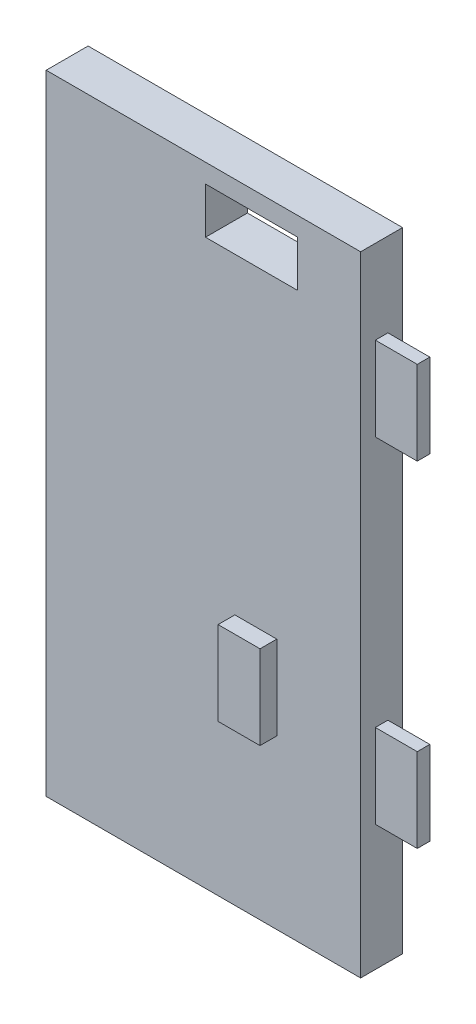
ISO-10303-21;
HEADER;
FILE_DESCRIPTION(('STEP AP214'),'2;1');
FILE_NAME('part.step','',(''),(''),'','','');
FILE_SCHEMA(('AUTOMOTIVE_DESIGN { 1 0 10303 214 1 1 1 1 }'));
ENDSEC;
DATA;
#1=APPLICATION_CONTEXT('core data for automotive mechanical design processes');
#2=APPLICATION_PROTOCOL_DEFINITION('international standard','automotive_design',2000,#1);
#3=PRODUCT_CONTEXT('',#1,'mechanical');
#4=PRODUCT('Part','Part','',(#3));
#5=PRODUCT_RELATED_PRODUCT_CATEGORY('part','',(#4));
#6=PRODUCT_DEFINITION_FORMATION('','',#4);
#7=PRODUCT_DEFINITION_CONTEXT('part definition',#1,'design');
#8=PRODUCT_DEFINITION('design','',#6,#7);
#9=PRODUCT_DEFINITION_SHAPE('','',#8);
#10=(LENGTH_UNIT() NAMED_UNIT(*) SI_UNIT(.MILLI.,.METRE.));
#11=(NAMED_UNIT(*) PLANE_ANGLE_UNIT() SI_UNIT($,.RADIAN.));
#12=(NAMED_UNIT(*) SI_UNIT($,.STERADIAN.) SOLID_ANGLE_UNIT());
#13=UNCERTAINTY_MEASURE_WITH_UNIT(LENGTH_MEASURE(1.E-05),#10,'distance_accuracy_value','');
#14=(GEOMETRIC_REPRESENTATION_CONTEXT(3) GLOBAL_UNCERTAINTY_ASSIGNED_CONTEXT((#13)) GLOBAL_UNIT_ASSIGNED_CONTEXT((#10,
#11,#12)) REPRESENTATION_CONTEXT('',''));
#15=CARTESIAN_POINT('',(0.,0.,0.));
#16=DIRECTION('',(0.,0.,1.));
#17=DIRECTION('',(1.,0.,0.));
#18=AXIS2_PLACEMENT_3D('',#15,#16,#17);
#19=CARTESIAN_POINT('',(37.5,-75.,10.));
#20=DIRECTION('',(-1.,0.,0.));
#21=DIRECTION('',(0.,0.,1.));
#22=AXIS2_PLACEMENT_3D('',#19,#20,#21);
#23=PLANE('',#22);
#24=DIRECTION('',(0.,0.,1.));
#25=VECTOR('',#24,1.);
#26=CARTESIAN_POINT('',(37.5,-25.,3.5));
#27=LINE('',#26,#25);
#28=CARTESIAN_POINT('',(37.5,-25.,3.5));
#29=VERTEX_POINT('',#28);
#30=CARTESIAN_POINT('',(37.5,-25.,6.5));
#31=VERTEX_POINT('',#30);
#32=EDGE_CURVE('E252',#29,#31,#27,.T.);
#33=ORIENTED_EDGE('',*,*,#32,.F.);
#34=DIRECTION('',(0.,1.,0.));
#35=VECTOR('',#34,1.);
#36=CARTESIAN_POINT('',(37.5,-45.,3.5));
#37=LINE('',#36,#35);
#38=CARTESIAN_POINT('',(37.5,-45.,3.5));
#39=VERTEX_POINT('',#38);
#40=EDGE_CURVE('E281',#39,#29,#37,.T.);
#41=ORIENTED_EDGE('',*,*,#40,.F.);
#42=DIRECTION('',(0.,0.,-1.));
#43=VECTOR('',#42,1.);
#44=CARTESIAN_POINT('',(37.5,-45.,3.5));
#45=LINE('',#44,#43);
#46=CARTESIAN_POINT('',(37.5,-45.,6.5));
#47=VERTEX_POINT('',#46);
#48=EDGE_CURVE('E287',#47,#39,#45,.T.);
#49=ORIENTED_EDGE('',*,*,#48,.F.);
#50=DIRECTION('',(0.,-1.,0.));
#51=VECTOR('',#50,1.);
#52=CARTESIAN_POINT('',(37.5,-45.,6.5));
#53=LINE('',#52,#51);
#54=EDGE_CURVE('E288',#31,#47,#53,.T.);
#55=ORIENTED_EDGE('',*,*,#54,.F.);
#56=EDGE_LOOP('',(#33,#41,#49,#55));
#57=FACE_BOUND('',#56,.T.);
#58=DIRECTION('',(0.,1.,0.));
#59=VECTOR('',#58,1.);
#60=CARTESIAN_POINT('',(37.5,-75.,0.));
#61=LINE('',#60,#59);
#62=CARTESIAN_POINT('',(37.5,-75.,0.));
#63=VERTEX_POINT('',#62);
#64=CARTESIAN_POINT('',(37.5,75.,0.));
#65=VERTEX_POINT('',#64);
#66=EDGE_CURVE('E367',#63,#65,#61,.T.);
#67=ORIENTED_EDGE('',*,*,#66,.T.);
#68=DIRECTION('',(0.,0.,-1.));
#69=VECTOR('',#68,1.);
#70=CARTESIAN_POINT('',(37.5,75.,10.));
#71=LINE('',#70,#69);
#72=CARTESIAN_POINT('',(37.5,75.,10.));
#73=VERTEX_POINT('',#72);
#74=EDGE_CURVE('E376',#73,#65,#71,.T.);
#75=ORIENTED_EDGE('',*,*,#74,.F.);
#76=DIRECTION('',(0.,1.,0.));
#77=VECTOR('',#76,1.);
#78=CARTESIAN_POINT('',(37.5,-75.,10.));
#79=LINE('',#78,#77);
#80=CARTESIAN_POINT('',(37.5,-75.,10.));
#81=VERTEX_POINT('',#80);
#82=EDGE_CURVE('E372',#81,#73,#79,.T.);
#83=ORIENTED_EDGE('',*,*,#82,.F.);
#84=DIRECTION('',(0.,0.,-1.));
#85=VECTOR('',#84,1.);
#86=CARTESIAN_POINT('',(37.5,-75.,10.));
#87=LINE('',#86,#85);
#88=EDGE_CURVE('E387',#81,#63,#87,.T.);
#89=ORIENTED_EDGE('',*,*,#88,.T.);
#90=EDGE_LOOP('',(#67,#75,#83,#89));
#91=FACE_BOUND('',#90,.T.);
#92=DIRECTION('',(0.,0.,1.));
#93=VECTOR('',#92,1.);
#94=CARTESIAN_POINT('',(37.5,55.,3.5));
#95=LINE('',#94,#93);
#96=CARTESIAN_POINT('',(37.5,55.,3.5));
#97=VERTEX_POINT('',#96);
#98=CARTESIAN_POINT('',(37.5,55.,6.5));
#99=VERTEX_POINT('',#98);
#100=EDGE_CURVE('E65',#97,#99,#95,.T.);
#101=ORIENTED_EDGE('',*,*,#100,.F.);
#102=DIRECTION('',(0.,1.,0.));
#103=VECTOR('',#102,1.);
#104=CARTESIAN_POINT('',(37.5,35.,3.5));
#105=LINE('',#104,#103);
#106=CARTESIAN_POINT('',(37.5,35.,3.5));
#107=VERTEX_POINT('',#106);
#108=EDGE_CURVE('E241',#107,#97,#105,.T.);
#109=ORIENTED_EDGE('',*,*,#108,.F.);
#110=DIRECTION('',(0.,0.,-1.));
#111=VECTOR('',#110,1.);
#112=CARTESIAN_POINT('',(37.5,35.,3.5));
#113=LINE('',#112,#111);
#114=CARTESIAN_POINT('',(37.5,35.,6.5));
#115=VERTEX_POINT('',#114);
#116=EDGE_CURVE('E254',#115,#107,#113,.T.);
#117=ORIENTED_EDGE('',*,*,#116,.F.);
#118=DIRECTION('',(0.,-1.,0.));
#119=VECTOR('',#118,1.);
#120=CARTESIAN_POINT('',(37.5,35.,6.5));
#121=LINE('',#120,#119);
#122=EDGE_CURVE('E253',#99,#115,#121,.T.);
#123=ORIENTED_EDGE('',*,*,#122,.F.);
#124=EDGE_LOOP('',(#101,#109,#117,#123));
#125=FACE_BOUND('',#124,.T.);
#126=ADVANCED_FACE('F39',(#57,#91,#125),#23,.F.);
#127=CARTESIAN_POINT('',(0.,0.,10.));
#128=DIRECTION('',(0.,0.,-1.));
#129=DIRECTION('',(-1.,0.,0.));
#130=AXIS2_PLACEMENT_3D('',#127,#128,#129);
#131=PLANE('',#130);
#132=DIRECTION('',(-1.,0.,0.));
#133=VECTOR('',#132,1.);
#134=CARTESIAN_POINT('',(22.5,70.5,10.));
#135=LINE('',#134,#133);
#136=CARTESIAN_POINT('',(22.5,70.5,10.));
#137=VERTEX_POINT('',#136);
#138=CARTESIAN_POINT('',(0.5,70.5,10.));
#139=VERTEX_POINT('',#138);
#140=EDGE_CURVE('E333',#137,#139,#135,.T.);
#141=ORIENTED_EDGE('',*,*,#140,.F.);
#142=DIRECTION('',(0.,1.,0.));
#143=VECTOR('',#142,1.);
#144=CARTESIAN_POINT('',(22.5,59.5,10.));
#145=LINE('',#144,#143);
#146=CARTESIAN_POINT('',(22.5,59.5,10.));
#147=VERTEX_POINT('',#146);
#148=EDGE_CURVE('E345',#147,#137,#145,.T.);
#149=ORIENTED_EDGE('',*,*,#148,.F.);
#150=DIRECTION('',(1.,0.,0.));
#151=VECTOR('',#150,1.);
#152=CARTESIAN_POINT('',(22.5,59.5,10.));
#153=LINE('',#152,#151);
#154=CARTESIAN_POINT('',(0.5,59.5,10.));
#155=VERTEX_POINT('',#154);
#156=EDGE_CURVE('E337',#155,#147,#153,.T.);
#157=ORIENTED_EDGE('',*,*,#156,.F.);
#158=DIRECTION('',(0.,-1.,0.));
#159=VECTOR('',#158,1.);
#160=CARTESIAN_POINT('',(0.5,59.5,10.));
#161=LINE('',#160,#159);
#162=EDGE_CURVE('E340',#139,#155,#161,.T.);
#163=ORIENTED_EDGE('',*,*,#162,.F.);
#164=EDGE_LOOP('',(#141,#149,#157,#163));
#165=FACE_BOUND('',#164,.T.);
#166=DIRECTION('',(-1.,0.,0.));
#167=VECTOR('',#166,1.);
#168=CARTESIAN_POINT('',(37.5,75.,10.));
#169=LINE('',#168,#167);
#170=CARTESIAN_POINT('',(-37.5,75.,10.));
#171=VERTEX_POINT('',#170);
#172=EDGE_CURVE('E368',#73,#171,#169,.T.);
#173=ORIENTED_EDGE('',*,*,#172,.T.);
#174=DIRECTION('',(0.,-1.,0.));
#175=VECTOR('',#174,1.);
#176=CARTESIAN_POINT('',(-37.5,-75.,10.));
#177=LINE('',#176,#175);
#178=CARTESIAN_POINT('',(-37.5,-75.,10.));
#179=VERTEX_POINT('',#178);
#180=EDGE_CURVE('E369',#171,#179,#177,.T.);
#181=ORIENTED_EDGE('',*,*,#180,.T.);
#182=DIRECTION('',(1.,0.,0.));
#183=VECTOR('',#182,1.);
#184=CARTESIAN_POINT('',(37.5,-75.,10.));
#185=LINE('',#184,#183);
#186=EDGE_CURVE('E375',#179,#81,#185,.T.);
#187=ORIENTED_EDGE('',*,*,#186,.T.);
#188=ORIENTED_EDGE('',*,*,#82,.T.);
#189=EDGE_LOOP('',(#173,#181,#187,#188));
#190=FACE_BOUND('',#189,.T.);
#191=DIRECTION('',(0.,1.,0.));
#192=VECTOR('',#191,1.);
#193=CARTESIAN_POINT('',(17.5,-35.,10.));
#194=LINE('',#193,#192);
#195=CARTESIAN_POINT('',(17.5,-35.,10.));
#196=VERTEX_POINT('',#195);
#197=CARTESIAN_POINT('',(17.5,-15.,10.));
#198=VERTEX_POINT('',#197);
#199=EDGE_CURVE('E269',#196,#198,#194,.T.);
#200=ORIENTED_EDGE('',*,*,#199,.F.);
#201=DIRECTION('',(1.,0.,0.));
#202=VECTOR('',#201,1.);
#203=CARTESIAN_POINT('',(7.5,-35.,10.));
#204=LINE('',#203,#202);
#205=CARTESIAN_POINT('',(7.5,-35.,10.));
#206=VERTEX_POINT('',#205);
#207=EDGE_CURVE('E308',#206,#196,#204,.T.);
#208=ORIENTED_EDGE('',*,*,#207,.F.);
#209=DIRECTION('',(0.,-1.,0.));
#210=VECTOR('',#209,1.);
#211=CARTESIAN_POINT('',(7.5,-35.,10.));
#212=LINE('',#211,#210);
#213=CARTESIAN_POINT('',(7.5,-15.,10.));
#214=VERTEX_POINT('',#213);
#215=EDGE_CURVE('E318',#214,#206,#212,.T.);
#216=ORIENTED_EDGE('',*,*,#215,.F.);
#217=DIRECTION('',(-1.,0.,0.));
#218=VECTOR('',#217,1.);
#219=CARTESIAN_POINT('',(7.5,-15.,10.));
#220=LINE('',#219,#218);
#221=EDGE_CURVE('E312',#198,#214,#220,.T.);
#222=ORIENTED_EDGE('',*,*,#221,.F.);
#223=EDGE_LOOP('',(#200,#208,#216,#222));
#224=FACE_BOUND('',#223,.T.);
#225=ADVANCED_FACE('F406',(#165,#190,#224),#131,.F.);
#226=CARTESIAN_POINT('',(0.,0.,0.));
#227=DIRECTION('',(0.,0.,-1.));
#228=DIRECTION('',(-1.,0.,0.));
#229=AXIS2_PLACEMENT_3D('',#226,#227,#228);
#230=PLANE('',#229);
#231=DIRECTION('',(-1.,0.,0.));
#232=VECTOR('',#231,1.);
#233=CARTESIAN_POINT('',(37.5,75.,0.));
#234=LINE('',#233,#232);
#235=CARTESIAN_POINT('',(-37.5,75.,0.));
#236=VERTEX_POINT('',#235);
#237=EDGE_CURVE('E364',#65,#236,#234,.T.);
#238=ORIENTED_EDGE('',*,*,#237,.F.);
#239=ORIENTED_EDGE('',*,*,#66,.F.);
#240=DIRECTION('',(1.,0.,0.));
#241=VECTOR('',#240,1.);
#242=CARTESIAN_POINT('',(37.5,-75.,0.));
#243=LINE('',#242,#241);
#244=CARTESIAN_POINT('',(-37.5,-75.,0.));
#245=VERTEX_POINT('',#244);
#246=EDGE_CURVE('E381',#245,#63,#243,.T.);
#247=ORIENTED_EDGE('',*,*,#246,.F.);
#248=DIRECTION('',(0.,-1.,0.));
#249=VECTOR('',#248,1.);
#250=CARTESIAN_POINT('',(-37.5,-75.,0.));
#251=LINE('',#250,#249);
#252=EDGE_CURVE('E377',#236,#245,#251,.T.);
#253=ORIENTED_EDGE('',*,*,#252,.F.);
#254=EDGE_LOOP('',(#238,#239,#247,#253));
#255=FACE_BOUND('',#254,.T.);
#256=DIRECTION('',(0.,1.,0.));
#257=VECTOR('',#256,1.);
#258=CARTESIAN_POINT('',(22.5,59.5,0.));
#259=LINE('',#258,#257);
#260=CARTESIAN_POINT('',(22.5,59.5,0.));
#261=VERTEX_POINT('',#260);
#262=CARTESIAN_POINT('',(22.5,70.5,0.));
#263=VERTEX_POINT('',#262);
#264=EDGE_CURVE('E336',#261,#263,#259,.T.);
#265=ORIENTED_EDGE('',*,*,#264,.T.);
#266=DIRECTION('',(-1.,0.,0.));
#267=VECTOR('',#266,1.);
#268=CARTESIAN_POINT('',(22.5,70.5,0.));
#269=LINE('',#268,#267);
#270=CARTESIAN_POINT('',(0.5,70.5,0.));
#271=VERTEX_POINT('',#270);
#272=EDGE_CURVE('E331',#263,#271,#269,.T.);
#273=ORIENTED_EDGE('',*,*,#272,.T.);
#274=DIRECTION('',(0.,-1.,0.));
#275=VECTOR('',#274,1.);
#276=CARTESIAN_POINT('',(0.5,59.5,0.));
#277=LINE('',#276,#275);
#278=CARTESIAN_POINT('',(0.5,59.5,0.));
#279=VERTEX_POINT('',#278);
#280=EDGE_CURVE('E346',#271,#279,#277,.T.);
#281=ORIENTED_EDGE('',*,*,#280,.T.);
#282=DIRECTION('',(1.,0.,0.));
#283=VECTOR('',#282,1.);
#284=CARTESIAN_POINT('',(22.5,59.5,0.));
#285=LINE('',#284,#283);
#286=EDGE_CURVE('E353',#279,#261,#285,.T.);
#287=ORIENTED_EDGE('',*,*,#286,.T.);
#288=EDGE_LOOP('',(#265,#273,#281,#287));
#289=FACE_BOUND('',#288,.T.);
#290=ADVANCED_FACE('F396',(#255,#289),#230,.T.);
#291=CARTESIAN_POINT('',(37.5,75.,10.));
#292=DIRECTION('',(0.,-1.,0.));
#293=DIRECTION('',(0.,0.,-1.));
#294=AXIS2_PLACEMENT_3D('',#291,#292,#293);
#295=PLANE('',#294);
#296=ORIENTED_EDGE('',*,*,#237,.T.);
#297=DIRECTION('',(0.,0.,-1.));
#298=VECTOR('',#297,1.);
#299=CARTESIAN_POINT('',(-37.5,75.,10.));
#300=LINE('',#299,#298);
#301=EDGE_CURVE('E11',#171,#236,#300,.T.);
#302=ORIENTED_EDGE('',*,*,#301,.F.);
#303=ORIENTED_EDGE('',*,*,#172,.F.);
#304=ORIENTED_EDGE('',*,*,#74,.T.);
#305=EDGE_LOOP('',(#296,#302,#303,#304));
#306=FACE_BOUND('',#305,.T.);
#307=ADVANCED_FACE('F41',(#306),#295,.F.);
#308=CARTESIAN_POINT('',(-37.5,-75.,10.));
#309=DIRECTION('',(1.,0.,0.));
#310=DIRECTION('',(0.,0.,-1.));
#311=AXIS2_PLACEMENT_3D('',#308,#309,#310);
#312=PLANE('',#311);
#313=ORIENTED_EDGE('',*,*,#252,.T.);
#314=DIRECTION('',(0.,0.,-1.));
#315=VECTOR('',#314,1.);
#316=CARTESIAN_POINT('',(-37.5,-75.,10.));
#317=LINE('',#316,#315);
#318=EDGE_CURVE('E50',#179,#245,#317,.T.);
#319=ORIENTED_EDGE('',*,*,#318,.F.);
#320=ORIENTED_EDGE('',*,*,#180,.F.);
#321=ORIENTED_EDGE('',*,*,#301,.T.);
#322=EDGE_LOOP('',(#313,#319,#320,#321));
#323=FACE_BOUND('',#322,.T.);
#324=ADVANCED_FACE('F407',(#323),#312,.F.);
#325=CARTESIAN_POINT('',(37.5,-75.,10.));
#326=DIRECTION('',(0.,1.,0.));
#327=DIRECTION('',(0.,0.,1.));
#328=AXIS2_PLACEMENT_3D('',#325,#326,#327);
#329=PLANE('',#328);
#330=DIRECTION('',(-1.,0.,0.));
#331=VECTOR('',#330,1.);
#332=CARTESIAN_POINT('',(-10.25,-75.,6.6));
#333=LINE('',#332,#331);
#334=CARTESIAN_POINT('',(10.25,-75.,6.6));
#335=VERTEX_POINT('',#334);
#336=CARTESIAN_POINT('',(-10.25,-75.,6.6));
#337=VERTEX_POINT('',#336);
#338=EDGE_CURVE('E229',#335,#337,#333,.T.);
#339=ORIENTED_EDGE('',*,*,#338,.F.);
#340=DIRECTION('',(0.,0.,1.));
#341=VECTOR('',#340,1.);
#342=CARTESIAN_POINT('',(10.25,-75.,3.4));
#343=LINE('',#342,#341);
#344=CARTESIAN_POINT('',(10.25,-75.,3.4));
#345=VERTEX_POINT('',#344);
#346=EDGE_CURVE('E53',#345,#335,#343,.T.);
#347=ORIENTED_EDGE('',*,*,#346,.F.);
#348=DIRECTION('',(1.,0.,0.));
#349=VECTOR('',#348,1.);
#350=CARTESIAN_POINT('',(-10.25,-75.,3.4));
#351=LINE('',#350,#349);
#352=CARTESIAN_POINT('',(-10.25,-75.,3.4));
#353=VERTEX_POINT('',#352);
#354=EDGE_CURVE('E219',#353,#345,#351,.T.);
#355=ORIENTED_EDGE('',*,*,#354,.F.);
#356=DIRECTION('',(0.,0.,-1.));
#357=VECTOR('',#356,1.);
#358=CARTESIAN_POINT('',(-10.25,-75.,3.4));
#359=LINE('',#358,#357);
#360=EDGE_CURVE('E224',#337,#353,#359,.T.);
#361=ORIENTED_EDGE('',*,*,#360,.F.);
#362=EDGE_LOOP('',(#339,#347,#355,#361));
#363=FACE_BOUND('',#362,.T.);
#364=ORIENTED_EDGE('',*,*,#246,.T.);
#365=ORIENTED_EDGE('',*,*,#88,.F.);
#366=ORIENTED_EDGE('',*,*,#186,.F.);
#367=ORIENTED_EDGE('',*,*,#318,.T.);
#368=EDGE_LOOP('',(#364,#365,#366,#367));
#369=FACE_BOUND('',#368,.T.);
#370=ADVANCED_FACE('F391',(#363,#369),#329,.F.);
#371=CARTESIAN_POINT('',(22.5,70.5,10.));
#372=DIRECTION('',(0.,-1.,0.));
#373=DIRECTION('',(0.,0.,-1.));
#374=AXIS2_PLACEMENT_3D('',#371,#372,#373);
#375=PLANE('',#374);
#376=ORIENTED_EDGE('',*,*,#272,.F.);
#377=DIRECTION('',(0.,0.,-1.));
#378=VECTOR('',#377,1.);
#379=CARTESIAN_POINT('',(22.5,70.5,10.));
#380=LINE('',#379,#378);
#381=EDGE_CURVE('E343',#137,#263,#380,.T.);
#382=ORIENTED_EDGE('',*,*,#381,.F.);
#383=ORIENTED_EDGE('',*,*,#140,.T.);
#384=DIRECTION('',(0.,0.,-1.));
#385=VECTOR('',#384,1.);
#386=CARTESIAN_POINT('',(0.5,70.5,10.));
#387=LINE('',#386,#385);
#388=EDGE_CURVE('E362',#139,#271,#387,.T.);
#389=ORIENTED_EDGE('',*,*,#388,.T.);
#390=EDGE_LOOP('',(#376,#382,#383,#389));
#391=FACE_BOUND('',#390,.T.);
#392=ADVANCED_FACE('F417',(#391),#375,.T.);
#393=CARTESIAN_POINT('',(0.5,59.5,10.));
#394=DIRECTION('',(1.,0.,0.));
#395=DIRECTION('',(0.,0.,-1.));
#396=AXIS2_PLACEMENT_3D('',#393,#394,#395);
#397=PLANE('',#396);
#398=ORIENTED_EDGE('',*,*,#280,.F.);
#399=ORIENTED_EDGE('',*,*,#388,.F.);
#400=ORIENTED_EDGE('',*,*,#162,.T.);
#401=DIRECTION('',(0.,0.,-1.));
#402=VECTOR('',#401,1.);
#403=CARTESIAN_POINT('',(0.5,59.5,10.));
#404=LINE('',#403,#402);
#405=EDGE_CURVE('E358',#155,#279,#404,.T.);
#406=ORIENTED_EDGE('',*,*,#405,.T.);
#407=EDGE_LOOP('',(#398,#399,#400,#406));
#408=FACE_BOUND('',#407,.T.);
#409=ADVANCED_FACE('F432',(#408),#397,.T.);
#410=CARTESIAN_POINT('',(22.5,59.5,10.));
#411=DIRECTION('',(0.,1.,0.));
#412=DIRECTION('',(0.,0.,1.));
#413=AXIS2_PLACEMENT_3D('',#410,#411,#412);
#414=PLANE('',#413);
#415=ORIENTED_EDGE('',*,*,#286,.F.);
#416=ORIENTED_EDGE('',*,*,#405,.F.);
#417=ORIENTED_EDGE('',*,*,#156,.T.);
#418=DIRECTION('',(0.,0.,-1.));
#419=VECTOR('',#418,1.);
#420=CARTESIAN_POINT('',(22.5,59.5,10.));
#421=LINE('',#420,#419);
#422=EDGE_CURVE('E360',#147,#261,#421,.T.);
#423=ORIENTED_EDGE('',*,*,#422,.T.);
#424=EDGE_LOOP('',(#415,#416,#417,#423));
#425=FACE_BOUND('',#424,.T.);
#426=ADVANCED_FACE('F437',(#425),#414,.T.);
#427=CARTESIAN_POINT('',(22.5,59.5,10.));
#428=DIRECTION('',(-1.,0.,0.));
#429=DIRECTION('',(0.,0.,1.));
#430=AXIS2_PLACEMENT_3D('',#427,#428,#429);
#431=PLANE('',#430);
#432=ORIENTED_EDGE('',*,*,#264,.F.);
#433=ORIENTED_EDGE('',*,*,#422,.F.);
#434=ORIENTED_EDGE('',*,*,#148,.T.);
#435=ORIENTED_EDGE('',*,*,#381,.T.);
#436=EDGE_LOOP('',(#432,#433,#434,#435));
#437=FACE_BOUND('',#436,.T.);
#438=ADVANCED_FACE('F445',(#437),#431,.T.);
#439=CARTESIAN_POINT('',(17.5,-35.,14.));
#440=DIRECTION('',(-1.,0.,0.));
#441=DIRECTION('',(0.,0.,1.));
#442=AXIS2_PLACEMENT_3D('',#439,#440,#441);
#443=PLANE('',#442);
#444=ORIENTED_EDGE('',*,*,#199,.T.);
#445=DIRECTION('',(0.,0.,-1.));
#446=VECTOR('',#445,1.);
#447=CARTESIAN_POINT('',(17.5,-15.,14.));
#448=LINE('',#447,#446);
#449=CARTESIAN_POINT('',(17.5,-15.,14.));
#450=VERTEX_POINT('',#449);
#451=EDGE_CURVE('E332',#450,#198,#448,.T.);
#452=ORIENTED_EDGE('',*,*,#451,.F.);
#453=DIRECTION('',(0.,1.,0.));
#454=VECTOR('',#453,1.);
#455=CARTESIAN_POINT('',(17.5,-35.,14.));
#456=LINE('',#455,#454);
#457=CARTESIAN_POINT('',(17.5,-35.,14.));
#458=VERTEX_POINT('',#457);
#459=EDGE_CURVE('E304',#458,#450,#456,.T.);
#460=ORIENTED_EDGE('',*,*,#459,.F.);
#461=DIRECTION('',(0.,0.,-1.));
#462=VECTOR('',#461,1.);
#463=CARTESIAN_POINT('',(17.5,-35.,14.));
#464=LINE('',#463,#462);
#465=EDGE_CURVE('E315',#458,#196,#464,.T.);
#466=ORIENTED_EDGE('',*,*,#465,.T.);
#467=EDGE_LOOP('',(#444,#452,#460,#466));
#468=FACE_BOUND('',#467,.T.);
#469=ADVANCED_FACE('F448',(#468),#443,.F.);
#470=CARTESIAN_POINT('',(7.5,-15.,14.));
#471=DIRECTION('',(0.,-1.,0.));
#472=DIRECTION('',(0.,0.,-1.));
#473=AXIS2_PLACEMENT_3D('',#470,#471,#472);
#474=PLANE('',#473);
#475=ORIENTED_EDGE('',*,*,#221,.T.);
#476=DIRECTION('',(0.,0.,-1.));
#477=VECTOR('',#476,1.);
#478=CARTESIAN_POINT('',(7.5,-15.,14.));
#479=LINE('',#478,#477);
#480=CARTESIAN_POINT('',(7.5,-15.,14.));
#481=VERTEX_POINT('',#480);
#482=EDGE_CURVE('E327',#481,#214,#479,.T.);
#483=ORIENTED_EDGE('',*,*,#482,.F.);
#484=DIRECTION('',(-1.,0.,0.));
#485=VECTOR('',#484,1.);
#486=CARTESIAN_POINT('',(7.5,-15.,14.));
#487=LINE('',#486,#485);
#488=EDGE_CURVE('E303',#450,#481,#487,.T.);
#489=ORIENTED_EDGE('',*,*,#488,.F.);
#490=ORIENTED_EDGE('',*,*,#451,.T.);
#491=EDGE_LOOP('',(#475,#483,#489,#490));
#492=FACE_BOUND('',#491,.T.);
#493=ADVANCED_FACE('F447',(#492),#474,.F.);
#494=CARTESIAN_POINT('',(7.5,-35.,14.));
#495=DIRECTION('',(1.,0.,0.));
#496=DIRECTION('',(0.,0.,-1.));
#497=AXIS2_PLACEMENT_3D('',#494,#495,#496);
#498=PLANE('',#497);
#499=ORIENTED_EDGE('',*,*,#215,.T.);
#500=DIRECTION('',(0.,0.,-1.));
#501=VECTOR('',#500,1.);
#502=CARTESIAN_POINT('',(7.5,-35.,14.));
#503=LINE('',#502,#501);
#504=CARTESIAN_POINT('',(7.5,-35.,14.));
#505=VERTEX_POINT('',#504);
#506=EDGE_CURVE('E324',#505,#206,#503,.T.);
#507=ORIENTED_EDGE('',*,*,#506,.F.);
#508=DIRECTION('',(0.,-1.,0.));
#509=VECTOR('',#508,1.);
#510=CARTESIAN_POINT('',(7.5,-35.,14.));
#511=LINE('',#510,#509);
#512=EDGE_CURVE('E306',#481,#505,#511,.T.);
#513=ORIENTED_EDGE('',*,*,#512,.F.);
#514=ORIENTED_EDGE('',*,*,#482,.T.);
#515=EDGE_LOOP('',(#499,#507,#513,#514));
#516=FACE_BOUND('',#515,.T.);
#517=ADVANCED_FACE('F451',(#516),#498,.F.);
#518=CARTESIAN_POINT('',(7.5,-35.,14.));
#519=DIRECTION('',(0.,1.,0.));
#520=DIRECTION('',(0.,0.,1.));
#521=AXIS2_PLACEMENT_3D('',#518,#519,#520);
#522=PLANE('',#521);
#523=ORIENTED_EDGE('',*,*,#207,.T.);
#524=ORIENTED_EDGE('',*,*,#465,.F.);
#525=DIRECTION('',(1.,0.,0.));
#526=VECTOR('',#525,1.);
#527=CARTESIAN_POINT('',(7.5,-35.,14.));
#528=LINE('',#527,#526);
#529=EDGE_CURVE('E309',#505,#458,#528,.T.);
#530=ORIENTED_EDGE('',*,*,#529,.F.);
#531=ORIENTED_EDGE('',*,*,#506,.T.);
#532=EDGE_LOOP('',(#523,#524,#530,#531));
#533=FACE_BOUND('',#532,.T.);
#534=ADVANCED_FACE('F456',(#533),#522,.F.);
#535=CARTESIAN_POINT('',(0.,0.,14.));
#536=DIRECTION('',(0.,0.,-1.));
#537=DIRECTION('',(-1.,0.,0.));
#538=AXIS2_PLACEMENT_3D('',#535,#536,#537);
#539=PLANE('',#538);
#540=ORIENTED_EDGE('',*,*,#459,.T.);
#541=ORIENTED_EDGE('',*,*,#488,.T.);
#542=ORIENTED_EDGE('',*,*,#512,.T.);
#543=ORIENTED_EDGE('',*,*,#529,.T.);
#544=EDGE_LOOP('',(#540,#541,#542,#543));
#545=FACE_BOUND('',#544,.T.);
#546=ADVANCED_FACE('F465',(#545),#539,.F.);
#547=CARTESIAN_POINT('',(47.5,-25.,3.5));
#548=DIRECTION('',(0.,-1.,0.));
#549=DIRECTION('',(0.,0.,-1.));
#550=AXIS2_PLACEMENT_3D('',#547,#548,#549);
#551=PLANE('',#550);
#552=ORIENTED_EDGE('',*,*,#32,.T.);
#553=DIRECTION('',(-1.,0.,0.));
#554=VECTOR('',#553,1.);
#555=CARTESIAN_POINT('',(47.5,-25.,6.5));
#556=LINE('',#555,#554);
#557=CARTESIAN_POINT('',(47.5,-25.,6.5));
#558=VERTEX_POINT('',#557);
#559=EDGE_CURVE('E233',#558,#31,#556,.T.);
#560=ORIENTED_EDGE('',*,*,#559,.F.);
#561=DIRECTION('',(0.,0.,1.));
#562=VECTOR('',#561,1.);
#563=CARTESIAN_POINT('',(47.5,-25.,3.5));
#564=LINE('',#563,#562);
#565=CARTESIAN_POINT('',(47.5,-25.,3.5));
#566=VERTEX_POINT('',#565);
#567=EDGE_CURVE('E289',#566,#558,#564,.T.);
#568=ORIENTED_EDGE('',*,*,#567,.F.);
#569=DIRECTION('',(-1.,0.,0.));
#570=VECTOR('',#569,1.);
#571=CARTESIAN_POINT('',(47.5,-25.,3.5));
#572=LINE('',#571,#570);
#573=EDGE_CURVE('E276',#566,#29,#572,.T.);
#574=ORIENTED_EDGE('',*,*,#573,.T.);
#575=EDGE_LOOP('',(#552,#560,#568,#574));
#576=FACE_BOUND('',#575,.T.);
#577=ADVANCED_FACE('F462',(#576),#551,.F.);
#578=CARTESIAN_POINT('',(47.5,-45.,6.5));
#579=DIRECTION('',(0.,0.,-1.));
#580=DIRECTION('',(-1.,0.,0.));
#581=AXIS2_PLACEMENT_3D('',#578,#579,#580);
#582=PLANE('',#581);
#583=ORIENTED_EDGE('',*,*,#54,.T.);
#584=DIRECTION('',(-1.,0.,0.));
#585=VECTOR('',#584,1.);
#586=CARTESIAN_POINT('',(47.5,-45.,6.5));
#587=LINE('',#586,#585);
#588=CARTESIAN_POINT('',(47.5,-45.,6.5));
#589=VERTEX_POINT('',#588);
#590=EDGE_CURVE('E272',#589,#47,#587,.T.);
#591=ORIENTED_EDGE('',*,*,#590,.F.);
#592=DIRECTION('',(0.,-1.,0.));
#593=VECTOR('',#592,1.);
#594=CARTESIAN_POINT('',(47.5,-45.,6.5));
#595=LINE('',#594,#593);
#596=EDGE_CURVE('E296',#558,#589,#595,.T.);
#597=ORIENTED_EDGE('',*,*,#596,.F.);
#598=ORIENTED_EDGE('',*,*,#559,.T.);
#599=EDGE_LOOP('',(#583,#591,#597,#598));
#600=FACE_BOUND('',#599,.T.);
#601=ADVANCED_FACE('F479',(#600),#582,.F.);
#602=CARTESIAN_POINT('',(47.5,-45.,3.5));
#603=DIRECTION('',(0.,1.,0.));
#604=DIRECTION('',(0.,0.,1.));
#605=AXIS2_PLACEMENT_3D('',#602,#603,#604);
#606=PLANE('',#605);
#607=ORIENTED_EDGE('',*,*,#48,.T.);
#608=DIRECTION('',(-1.,0.,0.));
#609=VECTOR('',#608,1.);
#610=CARTESIAN_POINT('',(47.5,-45.,3.5));
#611=LINE('',#610,#609);
#612=CARTESIAN_POINT('',(47.5,-45.,3.5));
#613=VERTEX_POINT('',#612);
#614=EDGE_CURVE('E277',#613,#39,#611,.T.);
#615=ORIENTED_EDGE('',*,*,#614,.F.);
#616=DIRECTION('',(0.,0.,-1.));
#617=VECTOR('',#616,1.);
#618=CARTESIAN_POINT('',(47.5,-45.,3.5));
#619=LINE('',#618,#617);
#620=EDGE_CURVE('E298',#589,#613,#619,.T.);
#621=ORIENTED_EDGE('',*,*,#620,.F.);
#622=ORIENTED_EDGE('',*,*,#590,.T.);
#623=EDGE_LOOP('',(#607,#615,#621,#622));
#624=FACE_BOUND('',#623,.T.);
#625=ADVANCED_FACE('F474',(#624),#606,.F.);
#626=CARTESIAN_POINT('',(47.5,-45.,3.5));
#627=DIRECTION('',(0.,0.,1.));
#628=DIRECTION('',(1.,0.,0.));
#629=AXIS2_PLACEMENT_3D('',#626,#627,#628);
#630=PLANE('',#629);
#631=ORIENTED_EDGE('',*,*,#40,.T.);
#632=ORIENTED_EDGE('',*,*,#573,.F.);
#633=DIRECTION('',(0.,1.,0.));
#634=VECTOR('',#633,1.);
#635=CARTESIAN_POINT('',(47.5,-45.,3.5));
#636=LINE('',#635,#634);
#637=EDGE_CURVE('E285',#613,#566,#636,.T.);
#638=ORIENTED_EDGE('',*,*,#637,.F.);
#639=ORIENTED_EDGE('',*,*,#614,.T.);
#640=EDGE_LOOP('',(#631,#632,#638,#639));
#641=FACE_BOUND('',#640,.T.);
#642=ADVANCED_FACE('F473',(#641),#630,.F.);
#643=CARTESIAN_POINT('',(47.5,0.,0.));
#644=DIRECTION('',(-1.,0.,0.));
#645=DIRECTION('',(0.,0.,1.));
#646=AXIS2_PLACEMENT_3D('',#643,#644,#645);
#647=PLANE('',#646);
#648=ORIENTED_EDGE('',*,*,#567,.T.);
#649=ORIENTED_EDGE('',*,*,#596,.T.);
#650=ORIENTED_EDGE('',*,*,#620,.T.);
#651=ORIENTED_EDGE('',*,*,#637,.T.);
#652=EDGE_LOOP('',(#648,#649,#650,#651));
#653=FACE_BOUND('',#652,.T.);
#654=ADVANCED_FACE('F469',(#653),#647,.F.);
#655=CARTESIAN_POINT('',(47.5,55.,3.5));
#656=DIRECTION('',(0.,-1.,0.));
#657=DIRECTION('',(0.,0.,-1.));
#658=AXIS2_PLACEMENT_3D('',#655,#656,#657);
#659=PLANE('',#658);
#660=ORIENTED_EDGE('',*,*,#100,.T.);
#661=DIRECTION('',(-1.,0.,0.));
#662=VECTOR('',#661,1.);
#663=CARTESIAN_POINT('',(47.5,55.,6.5));
#664=LINE('',#663,#662);
#665=CARTESIAN_POINT('',(47.5,55.,6.5));
#666=VERTEX_POINT('',#665);
#667=EDGE_CURVE('E270',#666,#99,#664,.T.);
#668=ORIENTED_EDGE('',*,*,#667,.F.);
#669=DIRECTION('',(0.,0.,1.));
#670=VECTOR('',#669,1.);
#671=CARTESIAN_POINT('',(47.5,55.,3.5));
#672=LINE('',#671,#670);
#673=CARTESIAN_POINT('',(47.5,55.,3.5));
#674=VERTEX_POINT('',#673);
#675=EDGE_CURVE('E239',#674,#666,#672,.T.);
#676=ORIENTED_EDGE('',*,*,#675,.F.);
#677=DIRECTION('',(-1.,0.,0.));
#678=VECTOR('',#677,1.);
#679=CARTESIAN_POINT('',(47.5,55.,3.5));
#680=LINE('',#679,#678);
#681=EDGE_CURVE('E246',#674,#97,#680,.T.);
#682=ORIENTED_EDGE('',*,*,#681,.T.);
#683=EDGE_LOOP('',(#660,#668,#676,#682));
#684=FACE_BOUND('',#683,.T.);
#685=ADVANCED_FACE('F468',(#684),#659,.F.);
#686=CARTESIAN_POINT('',(47.5,35.,6.5));
#687=DIRECTION('',(0.,0.,-1.));
#688=DIRECTION('',(-1.,0.,0.));
#689=AXIS2_PLACEMENT_3D('',#686,#687,#688);
#690=PLANE('',#689);
#691=ORIENTED_EDGE('',*,*,#122,.T.);
#692=DIRECTION('',(-1.,0.,0.));
#693=VECTOR('',#692,1.);
#694=CARTESIAN_POINT('',(47.5,35.,6.5));
#695=LINE('',#694,#693);
#696=CARTESIAN_POINT('',(47.5,35.,6.5));
#697=VERTEX_POINT('',#696);
#698=EDGE_CURVE('E262',#697,#115,#695,.T.);
#699=ORIENTED_EDGE('',*,*,#698,.F.);
#700=DIRECTION('',(0.,-1.,0.));
#701=VECTOR('',#700,1.);
#702=CARTESIAN_POINT('',(47.5,35.,6.5));
#703=LINE('',#702,#701);
#704=EDGE_CURVE('E245',#666,#697,#703,.T.);
#705=ORIENTED_EDGE('',*,*,#704,.F.);
#706=ORIENTED_EDGE('',*,*,#667,.T.);
#707=EDGE_LOOP('',(#691,#699,#705,#706));
#708=FACE_BOUND('',#707,.T.);
#709=ADVANCED_FACE('F488',(#708),#690,.F.);
#710=CARTESIAN_POINT('',(47.5,35.,3.5));
#711=DIRECTION('',(0.,1.,0.));
#712=DIRECTION('',(0.,0.,1.));
#713=AXIS2_PLACEMENT_3D('',#710,#711,#712);
#714=PLANE('',#713);
#715=ORIENTED_EDGE('',*,*,#116,.T.);
#716=DIRECTION('',(-1.,0.,0.));
#717=VECTOR('',#716,1.);
#718=CARTESIAN_POINT('',(47.5,35.,3.5));
#719=LINE('',#718,#717);
#720=CARTESIAN_POINT('',(47.5,35.,3.5));
#721=VERTEX_POINT('',#720);
#722=EDGE_CURVE('E261',#721,#107,#719,.T.);
#723=ORIENTED_EDGE('',*,*,#722,.F.);
#724=DIRECTION('',(0.,0.,-1.));
#725=VECTOR('',#724,1.);
#726=CARTESIAN_POINT('',(47.5,35.,3.5));
#727=LINE('',#726,#725);
#728=EDGE_CURVE('E242',#697,#721,#727,.T.);
#729=ORIENTED_EDGE('',*,*,#728,.F.);
#730=ORIENTED_EDGE('',*,*,#698,.T.);
#731=EDGE_LOOP('',(#715,#723,#729,#730));
#732=FACE_BOUND('',#731,.T.);
#733=ADVANCED_FACE('F495',(#732),#714,.F.);
#734=CARTESIAN_POINT('',(47.5,35.,3.5));
#735=DIRECTION('',(0.,0.,1.));
#736=DIRECTION('',(1.,0.,0.));
#737=AXIS2_PLACEMENT_3D('',#734,#735,#736);
#738=PLANE('',#737);
#739=ORIENTED_EDGE('',*,*,#108,.T.);
#740=ORIENTED_EDGE('',*,*,#681,.F.);
#741=DIRECTION('',(0.,1.,0.));
#742=VECTOR('',#741,1.);
#743=CARTESIAN_POINT('',(47.5,35.,3.5));
#744=LINE('',#743,#742);
#745=EDGE_CURVE('E249',#721,#674,#744,.T.);
#746=ORIENTED_EDGE('',*,*,#745,.F.);
#747=ORIENTED_EDGE('',*,*,#722,.T.);
#748=EDGE_LOOP('',(#739,#740,#746,#747));
#749=FACE_BOUND('',#748,.T.);
#750=ADVANCED_FACE('F497',(#749),#738,.F.);
#751=CARTESIAN_POINT('',(47.5,0.,0.));
#752=DIRECTION('',(-1.,0.,0.));
#753=DIRECTION('',(0.,0.,1.));
#754=AXIS2_PLACEMENT_3D('',#751,#752,#753);
#755=PLANE('',#754);
#756=ORIENTED_EDGE('',*,*,#675,.T.);
#757=ORIENTED_EDGE('',*,*,#704,.T.);
#758=ORIENTED_EDGE('',*,*,#728,.T.);
#759=ORIENTED_EDGE('',*,*,#745,.T.);
#760=EDGE_LOOP('',(#756,#757,#758,#759));
#761=FACE_BOUND('',#760,.T.);
#762=ADVANCED_FACE('F498',(#761),#755,.F.);
#763=CARTESIAN_POINT('',(10.25,-65.,3.4));
#764=DIRECTION('',(1.,0.,0.));
#765=DIRECTION('',(0.,0.,-1.));
#766=AXIS2_PLACEMENT_3D('',#763,#764,#765);
#767=PLANE('',#766);
#768=ORIENTED_EDGE('',*,*,#346,.T.);
#769=DIRECTION('',(0.,-1.,0.));
#770=VECTOR('',#769,1.);
#771=CARTESIAN_POINT('',(10.25,-65.,6.6));
#772=LINE('',#771,#770);
#773=CARTESIAN_POINT('',(10.25,-65.,6.6));
#774=VERTEX_POINT('',#773);
#775=EDGE_CURVE('E196',#774,#335,#772,.T.);
#776=ORIENTED_EDGE('',*,*,#775,.F.);
#777=DIRECTION('',(0.,0.,1.));
#778=VECTOR('',#777,1.);
#779=CARTESIAN_POINT('',(10.25,-65.,3.4));
#780=LINE('',#779,#778);
#781=CARTESIAN_POINT('',(10.25,-65.,3.4));
#782=VERTEX_POINT('',#781);
#783=EDGE_CURVE('E205',#782,#774,#780,.T.);
#784=ORIENTED_EDGE('',*,*,#783,.F.);
#785=DIRECTION('',(0.,-1.,0.));
#786=VECTOR('',#785,1.);
#787=CARTESIAN_POINT('',(10.25,-65.,3.4));
#788=LINE('',#787,#786);
#789=EDGE_CURVE('E235',#782,#345,#788,.T.);
#790=ORIENTED_EDGE('',*,*,#789,.T.);
#791=EDGE_LOOP('',(#768,#776,#784,#790));
#792=FACE_BOUND('',#791,.T.);
#793=ADVANCED_FACE('F199',(#792),#767,.F.);
#794=CARTESIAN_POINT('',(-10.25,-65.,3.4));
#795=DIRECTION('',(0.,0.,-1.));
#796=DIRECTION('',(-1.,0.,0.));
#797=AXIS2_PLACEMENT_3D('',#794,#795,#796);
#798=PLANE('',#797);
#799=ORIENTED_EDGE('',*,*,#354,.T.);
#800=ORIENTED_EDGE('',*,*,#789,.F.);
#801=DIRECTION('',(1.,0.,0.));
#802=VECTOR('',#801,1.);
#803=CARTESIAN_POINT('',(-10.25,-65.,3.4));
#804=LINE('',#803,#802);
#805=CARTESIAN_POINT('',(-10.25,-65.,3.4));
#806=VERTEX_POINT('',#805);
#807=EDGE_CURVE('E208',#806,#782,#804,.T.);
#808=ORIENTED_EDGE('',*,*,#807,.F.);
#809=DIRECTION('',(0.,-1.,0.));
#810=VECTOR('',#809,1.);
#811=CARTESIAN_POINT('',(-10.25,-65.,3.4));
#812=LINE('',#811,#810);
#813=EDGE_CURVE('E237',#806,#353,#812,.T.);
#814=ORIENTED_EDGE('',*,*,#813,.T.);
#815=EDGE_LOOP('',(#799,#800,#808,#814));
#816=FACE_BOUND('',#815,.T.);
#817=ADVANCED_FACE('F509',(#816),#798,.F.);
#818=CARTESIAN_POINT('',(-10.25,-65.,3.4));
#819=DIRECTION('',(-1.,0.,0.));
#820=DIRECTION('',(0.,0.,1.));
#821=AXIS2_PLACEMENT_3D('',#818,#819,#820);
#822=PLANE('',#821);
#823=ORIENTED_EDGE('',*,*,#360,.T.);
#824=ORIENTED_EDGE('',*,*,#813,.F.);
#825=DIRECTION('',(0.,0.,-1.));
#826=VECTOR('',#825,1.);
#827=CARTESIAN_POINT('',(-10.25,-65.,3.4));
#828=LINE('',#827,#826);
#829=CARTESIAN_POINT('',(-10.25,-65.,6.6));
#830=VERTEX_POINT('',#829);
#831=EDGE_CURVE('E216',#830,#806,#828,.T.);
#832=ORIENTED_EDGE('',*,*,#831,.F.);
#833=DIRECTION('',(0.,-1.,0.));
#834=VECTOR('',#833,1.);
#835=CARTESIAN_POINT('',(-10.25,-65.,6.6));
#836=LINE('',#835,#834);
#837=EDGE_CURVE('E210',#830,#337,#836,.T.);
#838=ORIENTED_EDGE('',*,*,#837,.T.);
#839=EDGE_LOOP('',(#823,#824,#832,#838));
#840=FACE_BOUND('',#839,.T.);
#841=ADVANCED_FACE('F508',(#840),#822,.F.);
#842=CARTESIAN_POINT('',(-10.25,-65.,6.6));
#843=DIRECTION('',(0.,0.,1.));
#844=DIRECTION('',(1.,0.,0.));
#845=AXIS2_PLACEMENT_3D('',#842,#843,#844);
#846=PLANE('',#845);
#847=ORIENTED_EDGE('',*,*,#338,.T.);
#848=ORIENTED_EDGE('',*,*,#837,.F.);
#849=DIRECTION('',(-1.,0.,0.));
#850=VECTOR('',#849,1.);
#851=CARTESIAN_POINT('',(-10.25,-65.,6.6));
#852=LINE('',#851,#850);
#853=EDGE_CURVE('E211',#774,#830,#852,.T.);
#854=ORIENTED_EDGE('',*,*,#853,.F.);
#855=ORIENTED_EDGE('',*,*,#775,.T.);
#856=EDGE_LOOP('',(#847,#848,#854,#855));
#857=FACE_BOUND('',#856,.T.);
#858=ADVANCED_FACE('F215',(#857),#846,.F.);
#859=CARTESIAN_POINT('',(0.,-65.,0.));
#860=DIRECTION('',(0.,1.,0.));
#861=DIRECTION('',(0.,0.,1.));
#862=AXIS2_PLACEMENT_3D('',#859,#860,#861);
#863=PLANE('',#862);
#864=ORIENTED_EDGE('',*,*,#783,.T.);
#865=ORIENTED_EDGE('',*,*,#853,.T.);
#866=ORIENTED_EDGE('',*,*,#831,.T.);
#867=ORIENTED_EDGE('',*,*,#807,.T.);
#868=EDGE_LOOP('',(#864,#865,#866,#867));
#869=FACE_BOUND('',#868,.T.);
#870=ADVANCED_FACE('F217',(#869),#863,.F.);
#871=CLOSED_SHELL('',(#126,#225,#290,#307,#324,#370,#392,#409,#426,#438,#469,#493,#517,#534,
#546,#577,#601,#625,#642,#654,#685,#709,#733,#750,#762,#793,#817,#841,#858,#870));
#872=MANIFOLD_SOLID_BREP('B2',#871);
#873=ADVANCED_BREP_SHAPE_REPRESENTATION('',(#18,#872),#14);
#874=SHAPE_DEFINITION_REPRESENTATION(#9,#873);
ENDSEC;
END-ISO-10303-21;
